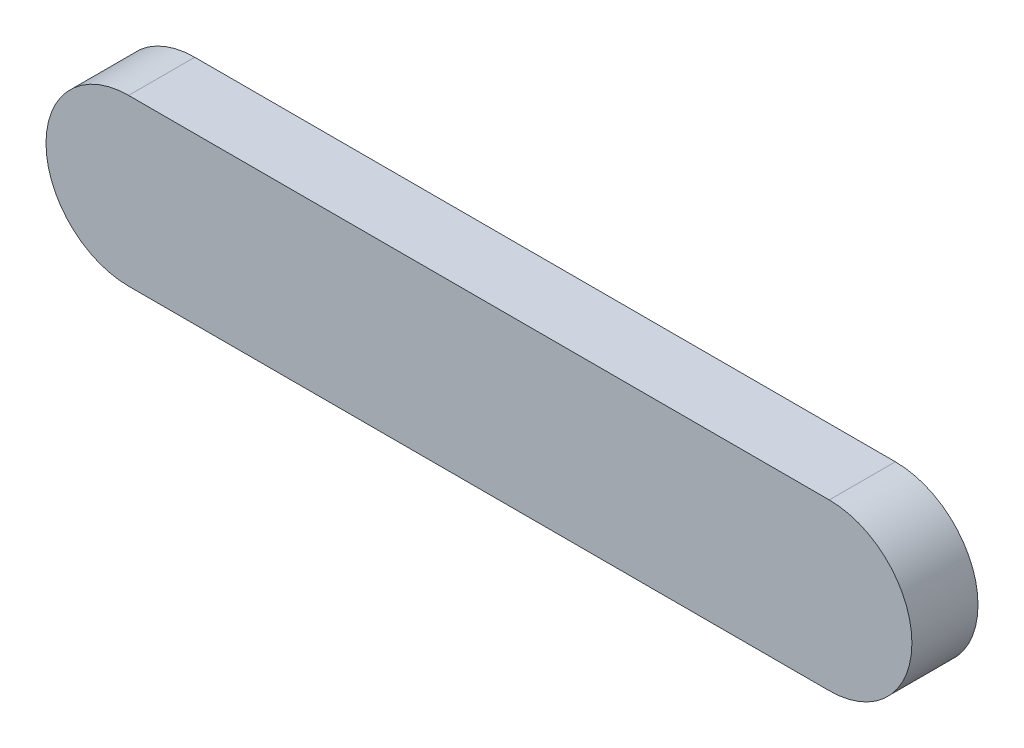
ISO-10303-21;
HEADER;
FILE_DESCRIPTION(('STEP AP214'),'2;1');
FILE_NAME('part.step','',(''),(''),'','','');
FILE_SCHEMA(('AUTOMOTIVE_DESIGN { 1 0 10303 214 1 1 1 1 }'));
ENDSEC;
DATA;
#1=APPLICATION_CONTEXT('core data for automotive mechanical design processes');
#2=APPLICATION_PROTOCOL_DEFINITION('international standard','automotive_design',2000,#1);
#3=PRODUCT_CONTEXT('',#1,'mechanical');
#4=PRODUCT('Part','Part','',(#3));
#5=PRODUCT_RELATED_PRODUCT_CATEGORY('part','',(#4));
#6=PRODUCT_DEFINITION_FORMATION('','',#4);
#7=PRODUCT_DEFINITION_CONTEXT('part definition',#1,'design');
#8=PRODUCT_DEFINITION('design','',#6,#7);
#9=PRODUCT_DEFINITION_SHAPE('','',#8);
#10=(LENGTH_UNIT() NAMED_UNIT(*) SI_UNIT(.MILLI.,.METRE.));
#11=(NAMED_UNIT(*) PLANE_ANGLE_UNIT() SI_UNIT($,.RADIAN.));
#12=(NAMED_UNIT(*) SI_UNIT($,.STERADIAN.) SOLID_ANGLE_UNIT());
#13=UNCERTAINTY_MEASURE_WITH_UNIT(LENGTH_MEASURE(1.E-05),#10,'distance_accuracy_value','');
#14=(GEOMETRIC_REPRESENTATION_CONTEXT(3) GLOBAL_UNCERTAINTY_ASSIGNED_CONTEXT((#13)) GLOBAL_UNIT_ASSIGNED_CONTEXT((#10,
#11,#12)) REPRESENTATION_CONTEXT('',''));
#15=CARTESIAN_POINT('',(0.,0.,0.));
#16=DIRECTION('',(0.,0.,1.));
#17=DIRECTION('',(1.,0.,0.));
#18=AXIS2_PLACEMENT_3D('',#15,#16,#17);
#19=CARTESIAN_POINT('',(0.,0.,20.));
#20=DIRECTION('',(0.,0.,-1.));
#21=DIRECTION('',(-1.,0.,0.));
#22=AXIS2_PLACEMENT_3D('',#19,#20,#21);
#23=CYLINDRICAL_SURFACE('',#22,25.);
#24=CARTESIAN_POINT('',(0.,0.,0.));
#25=DIRECTION('',(0.,0.,1.));
#26=DIRECTION('',(1.,0.,0.));
#27=AXIS2_PLACEMENT_3D('',#24,#25,#26);
#28=CIRCLE('',#27,25.);
#29=CARTESIAN_POINT('',(0.,25.,0.));
#30=VERTEX_POINT('',#29);
#31=CARTESIAN_POINT('',(0.,-25.,0.));
#32=VERTEX_POINT('',#31);
#33=EDGE_CURVE('E102',#30,#32,#28,.T.);
#34=ORIENTED_EDGE('',*,*,#33,.T.);
#35=DIRECTION('',(0.,0.,-1.));
#36=VECTOR('',#35,1.);
#37=CARTESIAN_POINT('',(0.,-25.,20.));
#38=LINE('',#37,#36);
#39=CARTESIAN_POINT('',(0.,-25.,20.));
#40=VERTEX_POINT('',#39);
#41=EDGE_CURVE('E11',#40,#32,#38,.T.);
#42=ORIENTED_EDGE('',*,*,#41,.F.);
#43=CARTESIAN_POINT('',(0.,0.,20.));
#44=DIRECTION('',(0.,0.,1.));
#45=DIRECTION('',(1.,0.,0.));
#46=AXIS2_PLACEMENT_3D('',#43,#44,#45);
#47=CIRCLE('',#46,25.);
#48=CARTESIAN_POINT('',(0.,25.,20.));
#49=VERTEX_POINT('',#48);
#50=EDGE_CURVE('E90',#49,#40,#47,.T.);
#51=ORIENTED_EDGE('',*,*,#50,.F.);
#52=DIRECTION('',(0.,0.,-1.));
#53=VECTOR('',#52,1.);
#54=CARTESIAN_POINT('',(0.,25.,20.));
#55=LINE('',#54,#53);
#56=EDGE_CURVE('E98',#49,#30,#55,.T.);
#57=ORIENTED_EDGE('',*,*,#56,.T.);
#58=EDGE_LOOP('',(#34,#42,#51,#57));
#59=FACE_BOUND('',#58,.T.);
#60=ADVANCED_FACE('F39',(#59),#23,.T.);
#61=CARTESIAN_POINT('',(0.,-25.,20.));
#62=DIRECTION('',(0.,1.,0.));
#63=DIRECTION('',(0.,0.,1.));
#64=AXIS2_PLACEMENT_3D('',#61,#62,#63);
#65=PLANE('',#64);
#66=DIRECTION('',(1.,0.,0.));
#67=VECTOR('',#66,1.);
#68=CARTESIAN_POINT('',(0.,-25.,0.));
#69=LINE('',#68,#67);
#70=CARTESIAN_POINT('',(212.,-25.,0.));
#71=VERTEX_POINT('',#70);
#72=EDGE_CURVE('E94',#32,#71,#69,.T.);
#73=ORIENTED_EDGE('',*,*,#72,.T.);
#74=DIRECTION('',(0.,0.,-1.));
#75=VECTOR('',#74,1.);
#76=CARTESIAN_POINT('',(212.,-25.,20.));
#77=LINE('',#76,#75);
#78=CARTESIAN_POINT('',(212.,-25.,20.));
#79=VERTEX_POINT('',#78);
#80=EDGE_CURVE('E47',#79,#71,#77,.T.);
#81=ORIENTED_EDGE('',*,*,#80,.F.);
#82=DIRECTION('',(1.,0.,0.));
#83=VECTOR('',#82,1.);
#84=CARTESIAN_POINT('',(0.,-25.,20.));
#85=LINE('',#84,#83);
#86=EDGE_CURVE('E85',#40,#79,#85,.T.);
#87=ORIENTED_EDGE('',*,*,#86,.F.);
#88=ORIENTED_EDGE('',*,*,#41,.T.);
#89=EDGE_LOOP('',(#73,#81,#87,#88));
#90=FACE_BOUND('',#89,.T.);
#91=ADVANCED_FACE('F93',(#90),#65,.F.);
#92=CARTESIAN_POINT('',(212.,0.,20.));
#93=DIRECTION('',(0.,0.,-1.));
#94=DIRECTION('',(-1.,0.,0.));
#95=AXIS2_PLACEMENT_3D('',#92,#93,#94);
#96=CYLINDRICAL_SURFACE('',#95,25.);
#97=CARTESIAN_POINT('',(212.,0.,0.));
#98=DIRECTION('',(0.,0.,1.));
#99=DIRECTION('',(1.,0.,0.));
#100=AXIS2_PLACEMENT_3D('',#97,#98,#99);
#101=CIRCLE('',#100,25.);
#102=CARTESIAN_POINT('',(212.,25.,0.));
#103=VERTEX_POINT('',#102);
#104=EDGE_CURVE('E72',#71,#103,#101,.T.);
#105=ORIENTED_EDGE('',*,*,#104,.T.);
#106=DIRECTION('',(0.,0.,-1.));
#107=VECTOR('',#106,1.);
#108=CARTESIAN_POINT('',(212.,25.,20.));
#109=LINE('',#108,#107);
#110=CARTESIAN_POINT('',(212.,25.,20.));
#111=VERTEX_POINT('',#110);
#112=EDGE_CURVE('E95',#111,#103,#109,.T.);
#113=ORIENTED_EDGE('',*,*,#112,.F.);
#114=CARTESIAN_POINT('',(212.,0.,20.));
#115=DIRECTION('',(0.,0.,1.));
#116=DIRECTION('',(1.,0.,0.));
#117=AXIS2_PLACEMENT_3D('',#114,#115,#116);
#118=CIRCLE('',#117,25.);
#119=EDGE_CURVE('E88',#79,#111,#118,.T.);
#120=ORIENTED_EDGE('',*,*,#119,.F.);
#121=ORIENTED_EDGE('',*,*,#80,.T.);
#122=EDGE_LOOP('',(#105,#113,#120,#121));
#123=FACE_BOUND('',#122,.T.);
#124=ADVANCED_FACE('F96',(#123),#96,.T.);
#125=CARTESIAN_POINT('',(0.,25.,20.));
#126=DIRECTION('',(0.,-1.,0.));
#127=DIRECTION('',(0.,0.,-1.));
#128=AXIS2_PLACEMENT_3D('',#125,#126,#127);
#129=PLANE('',#128);
#130=DIRECTION('',(-1.,0.,0.));
#131=VECTOR('',#130,1.);
#132=CARTESIAN_POINT('',(0.,25.,0.));
#133=LINE('',#132,#131);
#134=EDGE_CURVE('E78',#103,#30,#133,.T.);
#135=ORIENTED_EDGE('',*,*,#134,.T.);
#136=ORIENTED_EDGE('',*,*,#56,.F.);
#137=DIRECTION('',(-1.,0.,0.));
#138=VECTOR('',#137,1.);
#139=CARTESIAN_POINT('',(0.,25.,20.));
#140=LINE('',#139,#138);
#141=EDGE_CURVE('E55',#111,#49,#140,.T.);
#142=ORIENTED_EDGE('',*,*,#141,.F.);
#143=ORIENTED_EDGE('',*,*,#112,.T.);
#144=EDGE_LOOP('',(#135,#136,#142,#143));
#145=FACE_BOUND('',#144,.T.);
#146=ADVANCED_FACE('F109',(#145),#129,.F.);
#147=CARTESIAN_POINT('',(0.,0.,20.));
#148=DIRECTION('',(0.,0.,1.));
#149=DIRECTION('',(1.,0.,0.));
#150=AXIS2_PLACEMENT_3D('',#147,#148,#149);
#151=PLANE('',#150);
#152=ORIENTED_EDGE('',*,*,#50,.T.);
#153=ORIENTED_EDGE('',*,*,#86,.T.);
#154=ORIENTED_EDGE('',*,*,#119,.T.);
#155=ORIENTED_EDGE('',*,*,#141,.T.);
#156=EDGE_LOOP('',(#152,#153,#154,#155));
#157=FACE_BOUND('',#156,.T.);
#158=ADVANCED_FACE('F86',(#157),#151,.T.);
#159=CARTESIAN_POINT('',(0.,0.,0.));
#160=DIRECTION('',(0.,0.,1.));
#161=DIRECTION('',(1.,0.,0.));
#162=AXIS2_PLACEMENT_3D('',#159,#160,#161);
#163=PLANE('',#162);
#164=ORIENTED_EDGE('',*,*,#33,.F.);
#165=ORIENTED_EDGE('',*,*,#134,.F.);
#166=ORIENTED_EDGE('',*,*,#104,.F.);
#167=ORIENTED_EDGE('',*,*,#72,.F.);
#168=EDGE_LOOP('',(#164,#165,#166,#167));
#169=FACE_BOUND('',#168,.T.);
#170=ADVANCED_FACE('F112',(#169),#163,.F.);
#171=CLOSED_SHELL('',(#60,#91,#124,#146,#158,#170));
#172=MANIFOLD_SOLID_BREP('B2',#171);
#173=ADVANCED_BREP_SHAPE_REPRESENTATION('',(#18,#172),#14);
#174=SHAPE_DEFINITION_REPRESENTATION(#9,#173);
ENDSEC;
END-ISO-10303-21;
